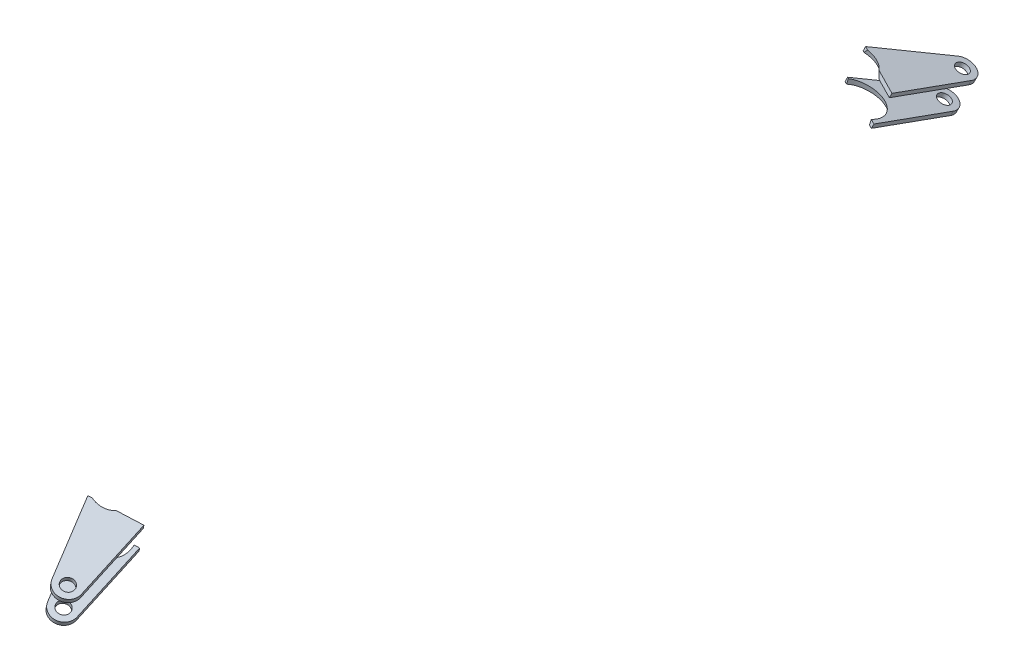
ISO-10303-21;
HEADER;
FILE_DESCRIPTION(('STEP AP214'),'2;1');
FILE_NAME('part.step','',(''),(''),'','','');
FILE_SCHEMA(('AUTOMOTIVE_DESIGN { 1 0 10303 214 1 1 1 1 }'));
ENDSEC;
DATA;
#1=APPLICATION_CONTEXT('core data for automotive mechanical design processes');
#2=APPLICATION_PROTOCOL_DEFINITION('international standard','automotive_design',2000,#1);
#3=PRODUCT_CONTEXT('',#1,'mechanical');
#4=PRODUCT('Part','Part','',(#3));
#5=PRODUCT_RELATED_PRODUCT_CATEGORY('part','',(#4));
#6=PRODUCT_DEFINITION_FORMATION('','',#4);
#7=PRODUCT_DEFINITION_CONTEXT('part definition',#1,'design');
#8=PRODUCT_DEFINITION('design','',#6,#7);
#9=PRODUCT_DEFINITION_SHAPE('','',#8);
#10=(LENGTH_UNIT() NAMED_UNIT(*) SI_UNIT(.MILLI.,.METRE.));
#11=(NAMED_UNIT(*) PLANE_ANGLE_UNIT() SI_UNIT($,.RADIAN.));
#12=(NAMED_UNIT(*) SI_UNIT($,.STERADIAN.) SOLID_ANGLE_UNIT());
#13=UNCERTAINTY_MEASURE_WITH_UNIT(LENGTH_MEASURE(1.E-05),#10,'distance_accuracy_value','');
#14=(GEOMETRIC_REPRESENTATION_CONTEXT(3) GLOBAL_UNCERTAINTY_ASSIGNED_CONTEXT((#13)) GLOBAL_UNIT_ASSIGNED_CONTEXT((#10,
#11,#12)) REPRESENTATION_CONTEXT('',''));
#15=CARTESIAN_POINT('',(0.,0.,0.));
#16=DIRECTION('',(0.,0.,1.));
#17=DIRECTION('',(1.,0.,0.));
#18=AXIS2_PLACEMENT_3D('',#15,#16,#17);
#19=CARTESIAN_POINT('',(65.509107510844,142.808017049709,61.5963410270793));
#20=DIRECTION('',(0.238532030320798,-0.311910311438893,0.919681699355343));
#21=DIRECTION('',(0.,0.947017715663108,0.321181329189959));
#22=AXIS2_PLACEMENT_3D('',#19,#20,#21);
#23=PLANE('',#22);
#24=CARTESIAN_POINT('',(-451.22587702484,300.360441759017,249.052578308913));
#25=DIRECTION('',(-0.238532030320798,0.311910311438893,-0.919681699355343));
#26=DIRECTION('',(-0.0564909458741268,-0.949870645928136,-0.307497201675579));
#27=AXIS2_PLACEMENT_3D('',#24,#25,#26);
#28=ELLIPSE('',#27,27.2986113026391,12.7);
#29=CARTESIAN_POINT('',(-439.445683527146,295.601499883743,244.383227469353));
#30=VERTEX_POINT('',#29);
#31=CARTESIAN_POINT('',(-439.077746763346,298.540869585477,245.284686111386));
#32=VERTEX_POINT('',#31);
#33=EDGE_CURVE('E62',#30,#32,#28,.F.);
#34=ORIENTED_EDGE('',*,*,#33,.T.);
#35=DIRECTION('',(-0.904396460600313,0.273659914769476,0.327379432924534));
#36=VECTOR('',#35,1.);
#37=CARTESIAN_POINT('',(66.5704866198724,145.537559113499,62.2467828068874));
#38=LINE('',#37,#36);
#39=CARTESIAN_POINT('',(-436.327090954802,297.708552933522,244.28898546681));
#40=VERTEX_POINT('',#39);
#41=EDGE_CURVE('E54',#40,#32,#38,.T.);
#42=ORIENTED_EDGE('',*,*,#41,.F.);
#43=DIRECTION('',(0.353793036342809,0.909847354596614,0.216813926602697));
#44=VECTOR('',#43,1.);
#45=CARTESIAN_POINT('',(-437.38847006383,294.979010869732,243.638543687002));
#46=LINE('',#45,#44);
#47=CARTESIAN_POINT('',(-437.38847006383,294.979010869732,243.638543687002));
#48=VERTEX_POINT('',#47);
#49=EDGE_CURVE('E160',#48,#40,#46,.T.);
#50=ORIENTED_EDGE('',*,*,#49,.F.);
#51=DIRECTION('',(-0.904396460600313,0.273659914769476,0.327379432924534));
#52=VECTOR('',#51,1.);
#53=CARTESIAN_POINT('',(65.509107510844,142.808017049709,61.5963410270793));
#54=LINE('',#53,#52);
#55=EDGE_CURVE('E122',#48,#30,#54,.T.);
#56=ORIENTED_EDGE('',*,*,#55,.T.);
#57=EDGE_LOOP('',(#34,#42,#50,#56));
#58=FACE_BOUND('',#57,.T.);
#59=ADVANCED_FACE('F50',(#58),#23,.F.);
#60=CARTESIAN_POINT('',(-440.64941340119,280.785016101808,308.523986498986));
#61=DIRECTION('',(0.856095376886292,-0.221635104127078,-0.466881769072747));
#62=DIRECTION('',(0.47878941810841,0.,0.877929776865673));
#63=AXIS2_PLACEMENT_3D('',#60,#61,#62);
#64=PLANE('',#63);
#65=DIRECTION('',(0.376737565301436,-0.350792918902482,0.857329070391657));
#66=VECTOR('',#65,1.);
#67=CARTESIAN_POINT('',(-439.588034292162,283.514558165598,309.174428278794));
#68=LINE('',#67,#66);
#69=CARTESIAN_POINT('',(-463.740195596516,306.003441521254,254.212163014794));
#70=VERTEX_POINT('',#69);
#71=CARTESIAN_POINT('',(-445.032900342176,288.584454641648,296.783728813158));
#72=VERTEX_POINT('',#71);
#73=EDGE_CURVE('E138',#70,#72,#68,.T.);
#74=ORIENTED_EDGE('',*,*,#73,.F.);
#75=DIRECTION('',(0.353793036342809,0.909847354596614,0.216813926602697));
#76=VECTOR('',#75,1.);
#77=CARTESIAN_POINT('',(-464.801574705544,303.273899457464,253.561721234986));
#78=LINE('',#77,#76);
#79=CARTESIAN_POINT('',(-464.801574705544,303.273899457464,253.561721234986));
#80=VERTEX_POINT('',#79);
#81=EDGE_CURVE('E116',#80,#70,#78,.T.);
#82=ORIENTED_EDGE('',*,*,#81,.F.);
#83=DIRECTION('',(0.376737565301436,-0.350792918902482,0.857329070391657));
#84=VECTOR('',#83,1.);
#85=CARTESIAN_POINT('',(-440.64941340119,280.785016101808,308.523986498986));
#86=LINE('',#85,#84);
#87=CARTESIAN_POINT('',(-446.094279451204,285.854912577858,296.13328703335));
#88=VERTEX_POINT('',#87);
#89=EDGE_CURVE('E128',#80,#88,#86,.T.);
#90=ORIENTED_EDGE('',*,*,#89,.T.);
#91=DIRECTION('',(0.353793036342809,0.909847354596614,0.216813926602697));
#92=VECTOR('',#91,1.);
#93=CARTESIAN_POINT('',(-446.094279451204,285.854912577858,296.13328703335));
#94=LINE('',#93,#92);
#95=EDGE_CURVE('E151',#88,#72,#94,.T.);
#96=ORIENTED_EDGE('',*,*,#95,.T.);
#97=EDGE_LOOP('',(#74,#82,#90,#96));
#98=FACE_BOUND('',#97,.T.);
#99=ADVANCED_FACE('F166',(#98),#64,.F.);
#100=CARTESIAN_POINT('',(-439.245516436114,284.081831744841,292.398232880768));
#101=DIRECTION('',(0.353793036342809,0.909847354596614,0.216813926602697));
#102=DIRECTION('',(-0.932017297863073,0.362413791796086,0.));
#103=AXIS2_PLACEMENT_3D('',#100,#101,#102);
#104=CYLINDRICAL_SURFACE('',#103,7.99999999999998);
#105=CARTESIAN_POINT('',(-438.184137327086,286.811373808631,293.048674660576));
#106=DIRECTION('',(0.35379303634281,0.909847354596614,0.216813926602697));
#107=DIRECTION('',(0.932017297863072,-0.362413791796086,0.));
#108=AXIS2_PLACEMENT_3D('',#105,#106,#107);
#109=CIRCLE('',#108,7.99999999999998);
#110=CARTESIAN_POINT('',(-430.756237334963,284.302047261385,291.458208695423));
#111=VERTEX_POINT('',#110);
#112=EDGE_CURVE('E163',#72,#111,#109,.T.);
#113=ORIENTED_EDGE('',*,*,#112,.F.);
#114=ORIENTED_EDGE('',*,*,#95,.F.);
#115=CARTESIAN_POINT('',(-439.245516436114,284.081831744841,292.398232880768));
#116=DIRECTION('',(0.35379303634281,0.909847354596614,0.216813926602697));
#117=DIRECTION('',(0.932017297863072,-0.362413791796086,0.));
#118=AXIS2_PLACEMENT_3D('',#115,#116,#117);
#119=CIRCLE('',#118,7.99999999999998);
#120=CARTESIAN_POINT('',(-431.817616443992,281.572505197595,290.807766915615));
#121=VERTEX_POINT('',#120);
#122=EDGE_CURVE('E129',#88,#121,#119,.T.);
#123=ORIENTED_EDGE('',*,*,#122,.T.);
#124=DIRECTION('',(0.353793036342809,0.909847354596614,0.216813926602697));
#125=VECTOR('',#124,1.);
#126=CARTESIAN_POINT('',(-431.817616443992,281.572505197595,290.807766915615));
#127=LINE('',#126,#125);
#128=EDGE_CURVE('E119',#121,#111,#127,.T.);
#129=ORIENTED_EDGE('',*,*,#128,.T.);
#130=EDGE_LOOP('',(#113,#114,#123,#129));
#131=FACE_BOUND('',#130,.T.);
#132=ADVANCED_FACE('F147',(#131),#104,.T.);
#133=CARTESIAN_POINT('',(-449.055234692874,323.055596048309,144.854360382786));
#134=DIRECTION('',(-0.928487499015328,0.313665818405775,0.198808245644131));
#135=DIRECTION('',(-0.320054618058769,-0.947399093022183,0.));
#136=AXIS2_PLACEMENT_3D('',#133,#134,#135);
#137=PLANE('',#136);
#138=DIRECTION('',(-0.112878038641702,0.271645993339455,-0.955754677045853));
#139=VECTOR('',#138,1.);
#140=CARTESIAN_POINT('',(-447.993855583846,325.785138112098,145.504802162594));
#141=LINE('',#140,#139);
#142=EDGE_CURVE('E155',#111,#40,#141,.T.);
#143=ORIENTED_EDGE('',*,*,#142,.F.);
#144=ORIENTED_EDGE('',*,*,#128,.F.);
#145=DIRECTION('',(-0.112878038641702,0.271645993339455,-0.955754677045853));
#146=VECTOR('',#145,1.);
#147=CARTESIAN_POINT('',(-449.055234692874,323.055596048309,144.854360382786));
#148=LINE('',#147,#146);
#149=EDGE_CURVE('E140',#121,#48,#148,.T.);
#150=ORIENTED_EDGE('',*,*,#149,.T.);
#151=ORIENTED_EDGE('',*,*,#49,.T.);
#152=EDGE_LOOP('',(#143,#144,#150,#151));
#153=FACE_BOUND('',#152,.T.);
#154=ADVANCED_FACE('F154',(#153),#137,.F.);
#155=CARTESIAN_POINT('',(-462.905614847322,305.750907033734,253.910055936423));
#156=VERTEX_POINT('',#155);
#157=CARTESIAN_POINT('',(-463.307444461638,302.821792916788,253.020866053354));
#158=VERTEX_POINT('',#157);
#159=EDGE_CURVE('E12',#156,#158,#28,.F.);
#160=ORIENTED_EDGE('',*,*,#159,.T.);
#161=EDGE_CURVE('E121',#158,#80,#54,.T.);
#162=ORIENTED_EDGE('',*,*,#161,.T.);
#163=ORIENTED_EDGE('',*,*,#81,.T.);
#164=EDGE_CURVE('E109',#156,#70,#38,.T.);
#165=ORIENTED_EDGE('',*,*,#164,.F.);
#166=EDGE_LOOP('',(#160,#162,#163,#165));
#167=FACE_BOUND('',#166,.T.);
#168=ADVANCED_FACE('F52',(#167),#23,.F.);
#169=CARTESIAN_POINT('',(-439.245516436114,284.081831744841,292.398232880768));
#170=DIRECTION('',(0.353793036342809,0.909847354596614,0.216813926602697));
#171=DIRECTION('',(-0.932017297863073,0.362413791796086,0.));
#172=AXIS2_PLACEMENT_3D('',#169,#170,#171);
#173=CYLINDRICAL_SURFACE('',#172,4.1);
#174=CARTESIAN_POINT('',(-439.245516436114,284.081831744841,292.398232880768));
#175=DIRECTION('',(0.35379303634281,0.909847354596614,0.216813926602697));
#176=DIRECTION('',(0.932017297863072,-0.362413791796086,0.));
#177=AXIS2_PLACEMENT_3D('',#174,#175,#176);
#178=CIRCLE('',#177,4.1);
#179=CARTESIAN_POINT('',(-435.424245514876,282.595935198477,292.398232880768));
#180=VERTEX_POINT('',#179);
#181=EDGE_CURVE('E118',#180,#180,#178,.T.);
#182=ORIENTED_EDGE('',*,*,#181,.F.);
#183=EDGE_LOOP('',(#182));
#184=FACE_BOUND('',#183,.T.);
#185=CARTESIAN_POINT('',(-438.184137327086,286.811373808631,293.048674660576));
#186=DIRECTION('',(0.35379303634281,0.909847354596614,0.216813926602697));
#187=DIRECTION('',(0.932017297863072,-0.362413791796086,0.));
#188=AXIS2_PLACEMENT_3D('',#185,#186,#187);
#189=CIRCLE('',#188,4.1);
#190=CARTESIAN_POINT('',(-434.362866405847,285.325477262267,293.048674660576));
#191=VERTEX_POINT('',#190);
#192=EDGE_CURVE('E142',#191,#191,#189,.T.);
#193=ORIENTED_EDGE('',*,*,#192,.T.);
#194=EDGE_LOOP('',(#193));
#195=FACE_BOUND('',#194,.T.);
#196=ADVANCED_FACE('F177',(#184,#195),#173,.F.);
#197=CARTESIAN_POINT('',(58.8941957018456,151.457837368224,36.0919535223756));
#198=DIRECTION('',(-0.35379303634281,-0.909847354596614,-0.216813926602697));
#199=DIRECTION('',(0.932017297863072,-0.362413791796086,0.));
#200=AXIS2_PLACEMENT_3D('',#197,#198,#199);
#201=PLANE('',#200);
#202=ORIENTED_EDGE('',*,*,#55,.F.);
#203=ORIENTED_EDGE('',*,*,#149,.F.);
#204=ORIENTED_EDGE('',*,*,#122,.F.);
#205=ORIENTED_EDGE('',*,*,#89,.F.);
#206=ORIENTED_EDGE('',*,*,#161,.F.);
#207=CARTESIAN_POINT('',(-451.140805445342,298.984679727286,249.26979301275));
#208=DIRECTION('',(0.35379303634281,0.909847354596614,0.216813926602697));
#209=DIRECTION('',(0.664485143138951,-0.407637223961837,0.626331691828136));
#210=AXIS2_PLACEMENT_3D('',#207,#208,#209);
#211=ELLIPSE('',#210,15.0880933522071,12.7);
#212=EDGE_CURVE('E70',#30,#158,#211,.F.);
#213=ORIENTED_EDGE('',*,*,#212,.F.);
#214=EDGE_LOOP('',(#202,#203,#204,#205,#206,#213));
#215=FACE_BOUND('',#214,.T.);
#216=ORIENTED_EDGE('',*,*,#181,.T.);
#217=EDGE_LOOP('',(#216));
#218=FACE_BOUND('',#217,.T.);
#219=ADVANCED_FACE('F125',(#215,#218),#201,.T.);
#220=CARTESIAN_POINT('',(59.9555748108741,154.187379432014,36.7423953021837));
#221=DIRECTION('',(-0.35379303634281,-0.909847354596614,-0.216813926602697));
#222=DIRECTION('',(0.932017297863072,-0.362413791796086,0.));
#223=AXIS2_PLACEMENT_3D('',#220,#221,#222);
#224=PLANE('',#223);
#225=CARTESIAN_POINT('',(-451.358094444602,302.498637700767,248.714985333152));
#226=DIRECTION('',(0.35379303634281,0.909847354596614,0.216813926602697));
#227=DIRECTION('',(0.664485143138951,-0.407637223961837,0.626331691828136));
#228=AXIS2_PLACEMENT_3D('',#225,#226,#227);
#229=ELLIPSE('',#228,15.0880933522071,12.7);
#230=EDGE_CURVE('E60',#32,#156,#229,.F.);
#231=ORIENTED_EDGE('',*,*,#230,.T.);
#232=ORIENTED_EDGE('',*,*,#164,.T.);
#233=ORIENTED_EDGE('',*,*,#73,.T.);
#234=ORIENTED_EDGE('',*,*,#112,.T.);
#235=ORIENTED_EDGE('',*,*,#142,.T.);
#236=ORIENTED_EDGE('',*,*,#41,.T.);
#237=EDGE_LOOP('',(#231,#232,#233,#234,#235,#236));
#238=FACE_BOUND('',#237,.T.);
#239=ORIENTED_EDGE('',*,*,#192,.F.);
#240=EDGE_LOOP('',(#239));
#241=FACE_BOUND('',#240,.T.);
#242=ADVANCED_FACE('F106',(#238,#241),#224,.F.);
#243=CARTESIAN_POINT('',(-454.575221179992,354.525423143221,240.500641187299));
#244=DIRECTION('',(0.0609657391469297,-0.985926788350095,0.155664853656615));
#245=DIRECTION('',(0.,0.155954951815569,0.987764168718528));
#246=AXIS2_PLACEMENT_3D('',#243,#244,#245);
#247=CYLINDRICAL_SURFACE('',#246,12.7);
#248=ORIENTED_EDGE('',*,*,#33,.F.);
#249=ORIENTED_EDGE('',*,*,#212,.T.);
#250=ORIENTED_EDGE('',*,*,#159,.F.);
#251=ORIENTED_EDGE('',*,*,#230,.F.);
#252=EDGE_LOOP('',(#248,#249,#250,#251));
#253=FACE_BOUND('',#252,.T.);
#254=ADVANCED_FACE('F120',(#253),#247,.F.);
#255=CLOSED_SHELL('',(#59,#99,#132,#154,#168,#196,#219,#242,#254));
#256=MANIFOLD_SOLID_BREP('B2',#255);
#257=CARTESIAN_POINT('',(74.0001403830716,164.644353560028,66.7998752655442));
#258=DIRECTION('',(0.238532030320798,-0.311910311438893,0.919681699355343));
#259=DIRECTION('',(-0.658959447664686,-0.747624203922958,-0.0826468150748394));
#260=AXIS2_PLACEMENT_3D('',#257,#258,#259);
#261=PLANE('',#260);
#262=CARTESIAN_POINT('',(-451.22587702484,300.360441759017,249.052578308913));
#263=DIRECTION('',(-0.238532030320798,0.311910311438893,-0.919681699355343));
#264=DIRECTION('',(-0.0564909458741268,-0.949870645928136,-0.30749720167558));
#265=AXIS2_PLACEMENT_3D('',#262,#263,#264);
#266=ELLIPSE('',#265,27.2986113026391,12.7);
#267=CARTESIAN_POINT('',(-440.853096983068,317.382288720289,252.135220168057));
#268=VERTEX_POINT('',#267);
#269=CARTESIAN_POINT('',(-442.396616524072,320.900043004722,253.728600448871));
#270=VERTEX_POINT('',#269);
#271=EDGE_CURVE('E48',#268,#270,#266,.F.);
#272=ORIENTED_EDGE('',*,*,#271,.T.);
#273=DIRECTION('',(-0.904396460600313,0.273659914769475,0.327379432924534));
#274=VECTOR('',#273,1.);
#275=CARTESIAN_POINT('',(74.0001403830716,164.644353560028,66.7998752655442));
#276=LINE('',#275,#274);
#277=CARTESIAN_POINT('',(-428.897437191603,316.815347380051,248.842077925466));
#278=VERTEX_POINT('',#277);
#279=EDGE_CURVE('E333',#278,#270,#276,.T.);
#280=ORIENTED_EDGE('',*,*,#279,.F.);
#281=DIRECTION('',(-0.353793036342809,-0.909847354596614,-0.216813926602697));
#282=VECTOR('',#281,1.);
#283=CARTESIAN_POINT('',(-428.897437191603,316.815347380051,248.842077925466));
#284=LINE('',#283,#282);
#285=CARTESIAN_POINT('',(-429.958816300631,314.085805316261,248.191636145658));
#286=VERTEX_POINT('',#285);
#287=EDGE_CURVE('E327',#278,#286,#284,.T.);
#288=ORIENTED_EDGE('',*,*,#287,.T.);
#289=DIRECTION('',(-0.904396460600313,0.273659914769475,0.327379432924534));
#290=VECTOR('',#289,1.);
#291=CARTESIAN_POINT('',(72.9387612740432,161.914811496238,66.1494334857361));
#292=LINE('',#291,#290);
#293=EDGE_CURVE('E265',#286,#268,#292,.T.);
#294=ORIENTED_EDGE('',*,*,#293,.T.);
#295=EDGE_LOOP('',(#272,#280,#288,#294));
#296=FACE_BOUND('',#295,.T.);
#297=ADVANCED_FACE('F261',(#296),#261,.F.);
#298=CARTESIAN_POINT('',(-432.158380528963,302.621352612126,313.727520737451));
#299=DIRECTION('',(0.856095376886292,-0.221635104127078,-0.466881769072747));
#300=DIRECTION('',(0.224242571165703,-0.654616545610361,0.72193659520082));
#301=AXIS2_PLACEMENT_3D('',#298,#299,#300);
#302=PLANE('',#301);
#303=DIRECTION('',(0.376737565301436,-0.350792918902481,0.857329070391657));
#304=VECTOR('',#303,1.);
#305=CARTESIAN_POINT('',(-433.219759637991,299.891810548337,313.077078957643));
#306=LINE('',#305,#304);
#307=CARTESIAN_POINT('',(-457.371920942345,322.380693903993,258.114813693642));
#308=VERTEX_POINT('',#307);
#309=CARTESIAN_POINT('',(-438.664625688005,304.961707024387,300.686379492006));
#310=VERTEX_POINT('',#309);
#311=EDGE_CURVE('E359',#308,#310,#306,.T.);
#312=ORIENTED_EDGE('',*,*,#311,.T.);
#313=DIRECTION('',(-0.353793036342809,-0.909847354596614,-0.216813926602697));
#314=VECTOR('',#313,1.);
#315=CARTESIAN_POINT('',(-437.603246578977,307.691249088177,301.336821271814));
#316=LINE('',#315,#314);
#317=CARTESIAN_POINT('',(-437.603246578977,307.691249088177,301.336821271814));
#318=VERTEX_POINT('',#317);
#319=EDGE_CURVE('E341',#318,#310,#316,.T.);
#320=ORIENTED_EDGE('',*,*,#319,.F.);
#321=DIRECTION('',(0.376737565301436,-0.350792918902481,0.857329070391657));
#322=VECTOR('',#321,1.);
#323=CARTESIAN_POINT('',(-432.158380528963,302.621352612126,313.727520737451));
#324=LINE('',#323,#322);
#325=CARTESIAN_POINT('',(-456.310541833317,325.110235967783,258.765255473451));
#326=VERTEX_POINT('',#325);
#327=EDGE_CURVE('E338',#326,#318,#324,.T.);
#328=ORIENTED_EDGE('',*,*,#327,.F.);
#329=DIRECTION('',(-0.353793036342809,-0.909847354596614,-0.216813926602697));
#330=VECTOR('',#329,1.);
#331=CARTESIAN_POINT('',(-456.310541833317,325.110235967783,258.765255473451));
#332=LINE('',#331,#330);
#333=EDGE_CURVE('E343',#326,#308,#332,.T.);
#334=ORIENTED_EDGE('',*,*,#333,.T.);
#335=EDGE_LOOP('',(#312,#320,#328,#334));
#336=FACE_BOUND('',#335,.T.);
#337=ADVANCED_FACE('F369',(#336),#302,.F.);
#338=CARTESIAN_POINT('',(-430.754483563887,305.91816825516,297.601767119232));
#339=DIRECTION('',(-0.353793036342809,-0.909847354596614,-0.216813926602697));
#340=DIRECTION('',(-0.932017297863073,0.362413791796086,0.));
#341=AXIS2_PLACEMENT_3D('',#338,#339,#340);
#342=CYLINDRICAL_SURFACE('',#341,7.99999999999998);
#343=CARTESIAN_POINT('',(-431.815862672915,303.18862619137,296.951325339424));
#344=DIRECTION('',(0.353793036342808,0.909847354596614,0.216813926602696));
#345=DIRECTION('',(0.932017297863073,-0.362413791796086,0.));
#346=AXIS2_PLACEMENT_3D('',#343,#344,#345);
#347=CIRCLE('',#346,7.99999999999998);
#348=CARTESIAN_POINT('',(-424.387962680793,300.679299644124,295.360859374271));
#349=VERTEX_POINT('',#348);
#350=EDGE_CURVE('E356',#310,#349,#347,.T.);
#351=ORIENTED_EDGE('',*,*,#350,.T.);
#352=DIRECTION('',(-0.353793036342809,-0.909847354596614,-0.216813926602697));
#353=VECTOR('',#352,1.);
#354=CARTESIAN_POINT('',(-423.326583571764,303.408841707914,296.011301154079));
#355=LINE('',#354,#353);
#356=CARTESIAN_POINT('',(-423.326583571764,303.408841707914,296.011301154079));
#357=VERTEX_POINT('',#356);
#358=EDGE_CURVE('E348',#357,#349,#355,.T.);
#359=ORIENTED_EDGE('',*,*,#358,.F.);
#360=CARTESIAN_POINT('',(-430.754483563887,305.91816825516,297.601767119232));
#361=DIRECTION('',(0.353793036342808,0.909847354596614,0.216813926602696));
#362=DIRECTION('',(0.932017297863073,-0.362413791796086,0.));
#363=AXIS2_PLACEMENT_3D('',#360,#361,#362);
#364=CIRCLE('',#363,7.99999999999998);
#365=EDGE_CURVE('E364',#318,#357,#364,.T.);
#366=ORIENTED_EDGE('',*,*,#365,.F.);
#367=ORIENTED_EDGE('',*,*,#319,.T.);
#368=EDGE_LOOP('',(#351,#359,#366,#367));
#369=FACE_BOUND('',#368,.T.);
#370=ADVANCED_FACE('F374',(#369),#342,.T.);
#371=CARTESIAN_POINT('',(-440.564201820647,344.891932558627,150.057894621251));
#372=DIRECTION('',(-0.928487499015328,0.313665818405775,0.198808245644131));
#373=DIRECTION('',(0.369998641846834,0.827206590419058,0.422883272072537));
#374=AXIS2_PLACEMENT_3D('',#371,#372,#373);
#375=PLANE('',#374);
#376=DIRECTION('',(-0.112878038641702,0.271645993339455,-0.955754677045853));
#377=VECTOR('',#376,1.);
#378=CARTESIAN_POINT('',(-441.625580929675,342.162390494837,149.407452841443));
#379=LINE('',#378,#377);
#380=EDGE_CURVE('E328',#349,#286,#379,.T.);
#381=ORIENTED_EDGE('',*,*,#380,.T.);
#382=ORIENTED_EDGE('',*,*,#287,.F.);
#383=DIRECTION('',(-0.112878038641702,0.271645993339455,-0.955754677045853));
#384=VECTOR('',#383,1.);
#385=CARTESIAN_POINT('',(-440.564201820647,344.891932558627,150.057894621251));
#386=LINE('',#385,#384);
#387=EDGE_CURVE('E337',#357,#278,#386,.T.);
#388=ORIENTED_EDGE('',*,*,#387,.F.);
#389=ORIENTED_EDGE('',*,*,#358,.T.);
#390=EDGE_LOOP('',(#381,#382,#388,#389));
#391=FACE_BOUND('',#390,.T.);
#392=ADVANCED_FACE('F376',(#391),#375,.F.);
#393=CARTESIAN_POINT('',(-454.198380439784,324.471120345249,258.000681274652));
#394=VERTEX_POINT('',#393);
#395=CARTESIAN_POINT('',(-456.511666358904,322.120390811002,257.803413030364));
#396=VERTEX_POINT('',#395);
#397=EDGE_CURVE('E273',#394,#396,#266,.F.);
#398=ORIENTED_EDGE('',*,*,#397,.T.);
#399=EDGE_CURVE('E321',#396,#308,#292,.T.);
#400=ORIENTED_EDGE('',*,*,#399,.T.);
#401=ORIENTED_EDGE('',*,*,#333,.F.);
#402=EDGE_CURVE('E339',#394,#326,#276,.T.);
#403=ORIENTED_EDGE('',*,*,#402,.F.);
#404=EDGE_LOOP('',(#398,#400,#401,#403));
#405=FACE_BOUND('',#404,.T.);
#406=ADVANCED_FACE('F263',(#405),#261,.F.);
#407=CARTESIAN_POINT('',(-430.754483563887,305.91816825516,297.601767119232));
#408=DIRECTION('',(-0.353793036342809,-0.909847354596614,-0.216813926602697));
#409=DIRECTION('',(-0.932017297863073,0.362413791796086,0.));
#410=AXIS2_PLACEMENT_3D('',#407,#408,#409);
#411=CYLINDRICAL_SURFACE('',#410,4.1);
#412=CARTESIAN_POINT('',(-430.754483563887,305.91816825516,297.601767119232));
#413=DIRECTION('',(0.353793036342808,0.909847354596614,0.216813926602696));
#414=DIRECTION('',(0.932017297863073,-0.362413791796086,0.));
#415=AXIS2_PLACEMENT_3D('',#412,#413,#414);
#416=CIRCLE('',#415,4.1);
#417=CARTESIAN_POINT('',(-426.933212642648,304.432271708796,297.601767119232));
#418=VERTEX_POINT('',#417);
#419=EDGE_CURVE('E330',#418,#418,#416,.T.);
#420=ORIENTED_EDGE('',*,*,#419,.T.);
#421=EDGE_LOOP('',(#420));
#422=FACE_BOUND('',#421,.T.);
#423=CARTESIAN_POINT('',(-431.815862672915,303.18862619137,296.951325339424));
#424=DIRECTION('',(0.353793036342808,0.909847354596614,0.216813926602696));
#425=DIRECTION('',(0.932017297863073,-0.362413791796086,0.));
#426=AXIS2_PLACEMENT_3D('',#423,#424,#425);
#427=CIRCLE('',#426,4.1);
#428=CARTESIAN_POINT('',(-427.994591751677,301.702729645006,296.951325339424));
#429=VERTEX_POINT('',#428);
#430=EDGE_CURVE('E331',#429,#429,#427,.T.);
#431=ORIENTED_EDGE('',*,*,#430,.F.);
#432=EDGE_LOOP('',(#431));
#433=FACE_BOUND('',#432,.T.);
#434=ADVANCED_FACE('F383',(#422,#433),#411,.F.);
#435=CARTESIAN_POINT('',(67.3852285740732,173.294173878543,41.2954877608404));
#436=DIRECTION('',(0.353793036342808,0.909847354596614,0.216813926602696));
#437=DIRECTION('',(0.932017297863073,-0.362413791796086,0.));
#438=AXIS2_PLACEMENT_3D('',#435,#436,#437);
#439=PLANE('',#438);
#440=ORIENTED_EDGE('',*,*,#402,.T.);
#441=ORIENTED_EDGE('',*,*,#327,.T.);
#442=ORIENTED_EDGE('',*,*,#365,.T.);
#443=ORIENTED_EDGE('',*,*,#387,.T.);
#444=ORIENTED_EDGE('',*,*,#279,.T.);
#445=CARTESIAN_POINT('',(-452.879117439424,327.096343515131,244.831331575971));
#446=DIRECTION('',(-0.353793036342808,-0.909847354596614,-0.216813926602696));
#447=DIRECTION('',(0.664485143138951,-0.407637223961835,0.626331691828137));
#448=AXIS2_PLACEMENT_3D('',#445,#446,#447);
#449=ELLIPSE('',#448,15.088093352207,12.7);
#450=EDGE_CURVE('E280',#394,#270,#449,.F.);
#451=ORIENTED_EDGE('',*,*,#450,.F.);
#452=EDGE_LOOP('',(#440,#441,#442,#443,#444,#451));
#453=FACE_BOUND('',#452,.T.);
#454=ORIENTED_EDGE('',*,*,#419,.F.);
#455=EDGE_LOOP('',(#454));
#456=FACE_BOUND('',#455,.T.);
#457=ADVANCED_FACE('F334',(#453,#456),#439,.T.);
#458=CARTESIAN_POINT('',(66.3238494650448,170.564631814754,40.6450459810323));
#459=DIRECTION('',(0.353793036342808,0.909847354596614,0.216813926602696));
#460=DIRECTION('',(0.932017297863073,-0.362413791796086,0.));
#461=AXIS2_PLACEMENT_3D('',#458,#459,#460);
#462=PLANE('',#461);
#463=CARTESIAN_POINT('',(-452.661828440164,323.58238554165,245.386139255568));
#464=DIRECTION('',(-0.353793036342808,-0.909847354596614,-0.216813926602696));
#465=DIRECTION('',(0.664485143138951,-0.407637223961835,0.626331691828137));
#466=AXIS2_PLACEMENT_3D('',#463,#464,#465);
#467=ELLIPSE('',#466,15.088093352207,12.7);
#468=EDGE_CURVE('E271',#396,#268,#467,.F.);
#469=ORIENTED_EDGE('',*,*,#468,.T.);
#470=ORIENTED_EDGE('',*,*,#293,.F.);
#471=ORIENTED_EDGE('',*,*,#380,.F.);
#472=ORIENTED_EDGE('',*,*,#350,.F.);
#473=ORIENTED_EDGE('',*,*,#311,.F.);
#474=ORIENTED_EDGE('',*,*,#399,.F.);
#475=EDGE_LOOP('',(#469,#470,#471,#472,#473,#474));
#476=FACE_BOUND('',#475,.T.);
#477=ORIENTED_EDGE('',*,*,#430,.T.);
#478=EDGE_LOOP('',(#477));
#479=FACE_BOUND('',#478,.T.);
#480=ADVANCED_FACE('F317',(#476,#479),#462,.F.);
#481=CARTESIAN_POINT('',(-454.575221179992,354.525423143221,240.500641187299));
#482=DIRECTION('',(0.0609657391469297,-0.985926788350095,0.155664853656615));
#483=DIRECTION('',(0.,0.155954951815569,0.987764168718528));
#484=AXIS2_PLACEMENT_3D('',#481,#482,#483);
#485=CYLINDRICAL_SURFACE('',#484,12.7);
#486=ORIENTED_EDGE('',*,*,#397,.F.);
#487=ORIENTED_EDGE('',*,*,#450,.T.);
#488=ORIENTED_EDGE('',*,*,#271,.F.);
#489=ORIENTED_EDGE('',*,*,#468,.F.);
#490=EDGE_LOOP('',(#486,#487,#488,#489));
#491=FACE_BOUND('',#490,.T.);
#492=ADVANCED_FACE('F329',(#491),#485,.F.);
#493=CLOSED_SHELL('',(#297,#337,#370,#392,#406,#434,#457,#480,#492));
#494=MANIFOLD_SOLID_BREP('B6',#493);
#495=CARTESIAN_POINT('',(65.509107510844,142.808017049709,-61.5963410270793));
#496=DIRECTION('',(0.238532030320798,-0.311910311438893,-0.919681699355343));
#497=DIRECTION('',(0.,0.947017715663108,-0.321181329189959));
#498=AXIS2_PLACEMENT_3D('',#495,#496,#497);
#499=PLANE('',#498);
#500=CARTESIAN_POINT('',(-451.22587702484,300.360441759017,-249.052578308913));
#501=DIRECTION('',(0.238532030320798,-0.311910311438893,-0.919681699355343));
#502=DIRECTION('',(-0.0564909458741268,-0.949870645928136,0.307497201675579));
#503=AXIS2_PLACEMENT_3D('',#500,#501,#502);
#504=ELLIPSE('',#503,27.2986113026391,12.7);
#505=CARTESIAN_POINT('',(-439.445683527146,295.601499883743,-244.383227469353));
#506=VERTEX_POINT('',#505);
#507=CARTESIAN_POINT('',(-439.077746763346,298.540869585477,-245.284686111386));
#508=VERTEX_POINT('',#507);
#509=EDGE_CURVE('E483',#506,#508,#504,.F.);
#510=ORIENTED_EDGE('',*,*,#509,.F.);
#511=DIRECTION('',(-0.904396460600313,0.273659914769476,-0.327379432924534));
#512=VECTOR('',#511,1.);
#513=CARTESIAN_POINT('',(65.509107510844,142.808017049709,-61.5963410270793));
#514=LINE('',#513,#512);
#515=CARTESIAN_POINT('',(-437.38847006383,294.979010869732,-243.638543687002));
#516=VERTEX_POINT('',#515);
#517=EDGE_CURVE('E541',#516,#506,#514,.T.);
#518=ORIENTED_EDGE('',*,*,#517,.F.);
#519=DIRECTION('',(0.353793036342809,0.909847354596614,-0.216813926602697));
#520=VECTOR('',#519,1.);
#521=CARTESIAN_POINT('',(-437.38847006383,294.979010869732,-243.638543687002));
#522=LINE('',#521,#520);
#523=CARTESIAN_POINT('',(-436.327090954802,297.708552933522,-244.28898546681));
#524=VERTEX_POINT('',#523);
#525=EDGE_CURVE('E546',#516,#524,#522,.T.);
#526=ORIENTED_EDGE('',*,*,#525,.T.);
#527=DIRECTION('',(-0.904396460600313,0.273659914769476,-0.327379432924534));
#528=VECTOR('',#527,1.);
#529=CARTESIAN_POINT('',(66.5704866198724,145.537559113499,-62.2467828068874));
#530=LINE('',#529,#528);
#531=EDGE_CURVE('E475',#524,#508,#530,.T.);
#532=ORIENTED_EDGE('',*,*,#531,.T.);
#533=EDGE_LOOP('',(#510,#518,#526,#532));
#534=FACE_BOUND('',#533,.T.);
#535=ADVANCED_FACE('F471',(#534),#499,.F.);
#536=CARTESIAN_POINT('',(-440.64941340119,280.785016101808,-308.523986498986));
#537=DIRECTION('',(0.856095376886292,-0.221635104127078,0.466881769072747));
#538=DIRECTION('',(0.47878941810841,0.,-0.877929776865673));
#539=AXIS2_PLACEMENT_3D('',#536,#537,#538);
#540=PLANE('',#539);
#541=DIRECTION('',(0.376737565301436,-0.350792918902482,-0.857329070391657));
#542=VECTOR('',#541,1.);
#543=CARTESIAN_POINT('',(-439.588034292162,283.514558165598,-309.174428278794));
#544=LINE('',#543,#542);
#545=CARTESIAN_POINT('',(-463.740195596516,306.003441521254,-254.212163014794));
#546=VERTEX_POINT('',#545);
#547=CARTESIAN_POINT('',(-445.032900342176,288.584454641648,-296.783728813158));
#548=VERTEX_POINT('',#547);
#549=EDGE_CURVE('E537',#546,#548,#544,.T.);
#550=ORIENTED_EDGE('',*,*,#549,.T.);
#551=DIRECTION('',(0.353793036342809,0.909847354596614,-0.216813926602697));
#552=VECTOR('',#551,1.);
#553=CARTESIAN_POINT('',(-446.094279451204,285.854912577858,-296.13328703335));
#554=LINE('',#553,#552);
#555=CARTESIAN_POINT('',(-446.094279451204,285.854912577858,-296.13328703335));
#556=VERTEX_POINT('',#555);
#557=EDGE_CURVE('E563',#556,#548,#554,.T.);
#558=ORIENTED_EDGE('',*,*,#557,.F.);
#559=DIRECTION('',(0.376737565301436,-0.350792918902482,-0.857329070391657));
#560=VECTOR('',#559,1.);
#561=CARTESIAN_POINT('',(-440.64941340119,280.785016101808,-308.523986498986));
#562=LINE('',#561,#560);
#563=CARTESIAN_POINT('',(-464.801574705544,303.273899457464,-253.561721234986));
#564=VERTEX_POINT('',#563);
#565=EDGE_CURVE('E568',#564,#556,#562,.T.);
#566=ORIENTED_EDGE('',*,*,#565,.F.);
#567=DIRECTION('',(0.353793036342809,0.909847354596614,-0.216813926602697));
#568=VECTOR('',#567,1.);
#569=CARTESIAN_POINT('',(-464.801574705544,303.273899457464,-253.561721234986));
#570=LINE('',#569,#568);
#571=EDGE_CURVE('E549',#564,#546,#570,.T.);
#572=ORIENTED_EDGE('',*,*,#571,.T.);
#573=EDGE_LOOP('',(#550,#558,#566,#572));
#574=FACE_BOUND('',#573,.T.);
#575=ADVANCED_FACE('F578',(#574),#540,.F.);
#576=CARTESIAN_POINT('',(-439.245516436114,284.081831744841,-292.398232880768));
#577=DIRECTION('',(0.353793036342809,0.909847354596614,-0.216813926602697));
#578=DIRECTION('',(-0.932017297863073,0.362413791796086,0.));
#579=AXIS2_PLACEMENT_3D('',#576,#577,#578);
#580=CYLINDRICAL_SURFACE('',#579,7.99999999999998);
#581=CARTESIAN_POINT('',(-438.184137327086,286.811373808631,-293.048674660576));
#582=DIRECTION('',(-0.35379303634281,-0.909847354596614,0.216813926602697));
#583=DIRECTION('',(0.932017297863072,-0.362413791796086,0.));
#584=AXIS2_PLACEMENT_3D('',#581,#582,#583);
#585=CIRCLE('',#584,7.99999999999998);
#586=CARTESIAN_POINT('',(-430.756237334963,284.302047261385,-291.458208695423));
#587=VERTEX_POINT('',#586);
#588=EDGE_CURVE('E557',#548,#587,#585,.T.);
#589=ORIENTED_EDGE('',*,*,#588,.T.);
#590=DIRECTION('',(0.353793036342809,0.909847354596614,-0.216813926602697));
#591=VECTOR('',#590,1.);
#592=CARTESIAN_POINT('',(-431.817616443992,281.572505197595,-290.807766915615));
#593=LINE('',#592,#591);
#594=CARTESIAN_POINT('',(-431.817616443992,281.572505197595,-290.807766915615));
#595=VERTEX_POINT('',#594);
#596=EDGE_CURVE('E539',#595,#587,#593,.T.);
#597=ORIENTED_EDGE('',*,*,#596,.F.);
#598=CARTESIAN_POINT('',(-439.245516436114,284.081831744841,-292.398232880768));
#599=DIRECTION('',(-0.35379303634281,-0.909847354596614,0.216813926602697));
#600=DIRECTION('',(0.932017297863072,-0.362413791796086,0.));
#601=AXIS2_PLACEMENT_3D('',#598,#599,#600);
#602=CIRCLE('',#601,7.99999999999998);
#603=EDGE_CURVE('E566',#556,#595,#602,.T.);
#604=ORIENTED_EDGE('',*,*,#603,.F.);
#605=ORIENTED_EDGE('',*,*,#557,.T.);
#606=EDGE_LOOP('',(#589,#597,#604,#605));
#607=FACE_BOUND('',#606,.T.);
#608=ADVANCED_FACE('F581',(#607),#580,.T.);
#609=CARTESIAN_POINT('',(-449.055234692874,323.055596048309,-144.854360382786));
#610=DIRECTION('',(-0.928487499015328,0.313665818405775,-0.198808245644131));
#611=DIRECTION('',(-0.320054618058769,-0.947399093022183,0.));
#612=AXIS2_PLACEMENT_3D('',#609,#610,#611);
#613=PLANE('',#612);
#614=DIRECTION('',(-0.112878038641702,0.271645993339455,0.955754677045853));
#615=VECTOR('',#614,1.);
#616=CARTESIAN_POINT('',(-447.993855583846,325.785138112098,-145.504802162594));
#617=LINE('',#616,#615);
#618=EDGE_CURVE('E544',#587,#524,#617,.T.);
#619=ORIENTED_EDGE('',*,*,#618,.T.);
#620=ORIENTED_EDGE('',*,*,#525,.F.);
#621=DIRECTION('',(-0.112878038641702,0.271645993339455,0.955754677045853));
#622=VECTOR('',#621,1.);
#623=CARTESIAN_POINT('',(-449.055234692874,323.055596048309,-144.854360382786));
#624=LINE('',#623,#622);
#625=EDGE_CURVE('E561',#595,#516,#624,.T.);
#626=ORIENTED_EDGE('',*,*,#625,.F.);
#627=ORIENTED_EDGE('',*,*,#596,.T.);
#628=EDGE_LOOP('',(#619,#620,#626,#627));
#629=FACE_BOUND('',#628,.T.);
#630=ADVANCED_FACE('F585',(#629),#613,.F.);
#631=CARTESIAN_POINT('',(-462.905614847322,305.750907033734,-253.910055936423));
#632=VERTEX_POINT('',#631);
#633=CARTESIAN_POINT('',(-463.307444461638,302.821792916788,-253.020866053354));
#634=VERTEX_POINT('',#633);
#635=EDGE_CURVE('E259',#632,#634,#504,.F.);
#636=ORIENTED_EDGE('',*,*,#635,.F.);
#637=EDGE_CURVE('E530',#632,#546,#530,.T.);
#638=ORIENTED_EDGE('',*,*,#637,.T.);
#639=ORIENTED_EDGE('',*,*,#571,.F.);
#640=EDGE_CURVE('E532',#634,#564,#514,.T.);
#641=ORIENTED_EDGE('',*,*,#640,.F.);
#642=EDGE_LOOP('',(#636,#638,#639,#641));
#643=FACE_BOUND('',#642,.T.);
#644=ADVANCED_FACE('F473',(#643),#499,.F.);
#645=CARTESIAN_POINT('',(-439.245516436114,284.081831744841,-292.398232880768));
#646=DIRECTION('',(0.353793036342809,0.909847354596614,-0.216813926602697));
#647=DIRECTION('',(-0.932017297863073,0.362413791796086,0.));
#648=AXIS2_PLACEMENT_3D('',#645,#646,#647);
#649=CYLINDRICAL_SURFACE('',#648,4.1);
#650=CARTESIAN_POINT('',(-439.245516436114,284.081831744841,-292.398232880768));
#651=DIRECTION('',(-0.35379303634281,-0.909847354596614,0.216813926602697));
#652=DIRECTION('',(0.932017297863072,-0.362413791796086,0.));
#653=AXIS2_PLACEMENT_3D('',#650,#651,#652);
#654=CIRCLE('',#653,4.1);
#655=CARTESIAN_POINT('',(-435.424245514876,282.595935198477,-292.398232880768));
#656=VERTEX_POINT('',#655);
#657=EDGE_CURVE('E538',#656,#656,#654,.T.);
#658=ORIENTED_EDGE('',*,*,#657,.T.);
#659=EDGE_LOOP('',(#658));
#660=FACE_BOUND('',#659,.T.);
#661=CARTESIAN_POINT('',(-438.184137327086,286.811373808631,-293.048674660576));
#662=DIRECTION('',(-0.35379303634281,-0.909847354596614,0.216813926602697));
#663=DIRECTION('',(0.932017297863072,-0.362413791796086,0.));
#664=AXIS2_PLACEMENT_3D('',#661,#662,#663);
#665=CIRCLE('',#664,4.1);
#666=CARTESIAN_POINT('',(-434.362866405847,285.325477262267,-293.048674660576));
#667=VERTEX_POINT('',#666);
#668=EDGE_CURVE('E558',#667,#667,#665,.T.);
#669=ORIENTED_EDGE('',*,*,#668,.F.);
#670=EDGE_LOOP('',(#669));
#671=FACE_BOUND('',#670,.T.);
#672=ADVANCED_FACE('F593',(#660,#671),#649,.F.);
#673=CARTESIAN_POINT('',(58.8941957018456,151.457837368224,-36.0919535223756));
#674=DIRECTION('',(-0.35379303634281,-0.909847354596614,0.216813926602697));
#675=DIRECTION('',(0.932017297863072,-0.362413791796086,0.));
#676=AXIS2_PLACEMENT_3D('',#673,#674,#675);
#677=PLANE('',#676);
#678=ORIENTED_EDGE('',*,*,#517,.T.);
#679=CARTESIAN_POINT('',(-451.140805445342,298.984679727286,-249.26979301275));
#680=DIRECTION('',(-0.35379303634281,-0.909847354596614,0.216813926602697));
#681=DIRECTION('',(0.664485143138951,-0.407637223961837,-0.626331691828136));
#682=AXIS2_PLACEMENT_3D('',#679,#680,#681);
#683=ELLIPSE('',#682,15.0880933522071,12.7);
#684=EDGE_CURVE('E490',#506,#634,#683,.F.);
#685=ORIENTED_EDGE('',*,*,#684,.T.);
#686=ORIENTED_EDGE('',*,*,#640,.T.);
#687=ORIENTED_EDGE('',*,*,#565,.T.);
#688=ORIENTED_EDGE('',*,*,#603,.T.);
#689=ORIENTED_EDGE('',*,*,#625,.T.);
#690=EDGE_LOOP('',(#678,#685,#686,#687,#688,#689));
#691=FACE_BOUND('',#690,.T.);
#692=ORIENTED_EDGE('',*,*,#657,.F.);
#693=EDGE_LOOP('',(#692));
#694=FACE_BOUND('',#693,.T.);
#695=ADVANCED_FACE('F573',(#691,#694),#677,.T.);
#696=CARTESIAN_POINT('',(59.9555748108741,154.187379432014,-36.7423953021837));
#697=DIRECTION('',(-0.35379303634281,-0.909847354596614,0.216813926602697));
#698=DIRECTION('',(0.932017297863072,-0.362413791796086,0.));
#699=AXIS2_PLACEMENT_3D('',#696,#697,#698);
#700=PLANE('',#699);
#701=CARTESIAN_POINT('',(-451.358094444602,302.498637700767,-248.714985333152));
#702=DIRECTION('',(-0.35379303634281,-0.909847354596614,0.216813926602697));
#703=DIRECTION('',(0.664485143138951,-0.407637223961837,-0.626331691828136));
#704=AXIS2_PLACEMENT_3D('',#701,#702,#703);
#705=ELLIPSE('',#704,15.0880933522071,12.7);
#706=EDGE_CURVE('E481',#508,#632,#705,.F.);
#707=ORIENTED_EDGE('',*,*,#706,.F.);
#708=ORIENTED_EDGE('',*,*,#531,.F.);
#709=ORIENTED_EDGE('',*,*,#618,.F.);
#710=ORIENTED_EDGE('',*,*,#588,.F.);
#711=ORIENTED_EDGE('',*,*,#549,.F.);
#712=ORIENTED_EDGE('',*,*,#637,.F.);
#713=EDGE_LOOP('',(#707,#708,#709,#710,#711,#712));
#714=FACE_BOUND('',#713,.T.);
#715=ORIENTED_EDGE('',*,*,#668,.T.);
#716=EDGE_LOOP('',(#715));
#717=FACE_BOUND('',#716,.T.);
#718=ADVANCED_FACE('F534',(#714,#717),#700,.F.);
#719=CARTESIAN_POINT('',(-454.575221179992,354.525423143221,-240.500641187299));
#720=DIRECTION('',(0.0609657391469297,-0.985926788350095,-0.155664853656615));
#721=DIRECTION('',(0.,0.155954951815569,-0.987764168718528));
#722=AXIS2_PLACEMENT_3D('',#719,#720,#721);
#723=CYLINDRICAL_SURFACE('',#722,12.7);
#724=ORIENTED_EDGE('',*,*,#509,.T.);
#725=ORIENTED_EDGE('',*,*,#706,.T.);
#726=ORIENTED_EDGE('',*,*,#635,.T.);
#727=ORIENTED_EDGE('',*,*,#684,.F.);
#728=EDGE_LOOP('',(#724,#725,#726,#727));
#729=FACE_BOUND('',#728,.T.);
#730=ADVANCED_FACE('F521',(#729),#723,.F.);
#731=CLOSED_SHELL('',(#535,#575,#608,#630,#644,#672,#695,#718,#730));
#732=MANIFOLD_SOLID_BREP('B42',#731);
#733=CARTESIAN_POINT('',(74.0001403830716,164.644353560028,-66.7998752655442));
#734=DIRECTION('',(0.238532030320798,-0.311910311438893,-0.919681699355343));
#735=DIRECTION('',(-0.658959447664686,-0.747624203922958,0.0826468150748394));
#736=AXIS2_PLACEMENT_3D('',#733,#734,#735);
#737=PLANE('',#736);
#738=CARTESIAN_POINT('',(-451.22587702484,300.360441759017,-249.052578308913));
#739=DIRECTION('',(0.238532030320798,-0.311910311438893,-0.919681699355343));
#740=DIRECTION('',(-0.0564909458741268,-0.949870645928136,0.30749720167558));
#741=AXIS2_PLACEMENT_3D('',#738,#739,#740);
#742=ELLIPSE('',#741,27.2986113026391,12.7);
#743=CARTESIAN_POINT('',(-440.853096983068,317.382288720289,-252.135220168057));
#744=VERTEX_POINT('',#743);
#745=CARTESIAN_POINT('',(-442.396616524072,320.900043004722,-253.728600448871));
#746=VERTEX_POINT('',#745);
#747=EDGE_CURVE('E469',#744,#746,#742,.F.);
#748=ORIENTED_EDGE('',*,*,#747,.F.);
#749=DIRECTION('',(-0.904396460600313,0.273659914769475,-0.327379432924534));
#750=VECTOR('',#749,1.);
#751=CARTESIAN_POINT('',(72.9387612740432,161.914811496238,-66.1494334857361));
#752=LINE('',#751,#750);
#753=CARTESIAN_POINT('',(-429.958816300631,314.085805316261,-248.191636145658));
#754=VERTEX_POINT('',#753);
#755=EDGE_CURVE('E676',#754,#744,#752,.T.);
#756=ORIENTED_EDGE('',*,*,#755,.F.);
#757=DIRECTION('',(-0.353793036342809,-0.909847354596614,0.216813926602697));
#758=VECTOR('',#757,1.);
#759=CARTESIAN_POINT('',(-428.897437191603,316.815347380051,-248.842077925466));
#760=LINE('',#759,#758);
#761=CARTESIAN_POINT('',(-428.897437191603,316.815347380051,-248.842077925466));
#762=VERTEX_POINT('',#761);
#763=EDGE_CURVE('E756',#762,#754,#760,.T.);
#764=ORIENTED_EDGE('',*,*,#763,.F.);
#765=DIRECTION('',(-0.904396460600313,0.273659914769475,-0.327379432924534));
#766=VECTOR('',#765,1.);
#767=CARTESIAN_POINT('',(74.0001403830716,164.644353560028,-66.7998752655442));
#768=LINE('',#767,#766);
#769=EDGE_CURVE('E731',#762,#746,#768,.T.);
#770=ORIENTED_EDGE('',*,*,#769,.T.);
#771=EDGE_LOOP('',(#748,#756,#764,#770));
#772=FACE_BOUND('',#771,.T.);
#773=ADVANCED_FACE('F672',(#772),#737,.F.);
#774=CARTESIAN_POINT('',(-432.158380528963,302.621352612126,-313.727520737451));
#775=DIRECTION('',(0.856095376886292,-0.221635104127078,0.466881769072747));
#776=DIRECTION('',(0.224242571165703,-0.654616545610361,-0.72193659520082));
#777=AXIS2_PLACEMENT_3D('',#774,#775,#776);
#778=PLANE('',#777);
#779=DIRECTION('',(0.376737565301436,-0.350792918902481,-0.857329070391657));
#780=VECTOR('',#779,1.);
#781=CARTESIAN_POINT('',(-433.219759637991,299.891810548337,-313.077078957643));
#782=LINE('',#781,#780);
#783=CARTESIAN_POINT('',(-457.371920942345,322.380693903993,-258.114813693642));
#784=VERTEX_POINT('',#783);
#785=CARTESIAN_POINT('',(-438.664625688005,304.961707024387,-300.686379492006));
#786=VERTEX_POINT('',#785);
#787=EDGE_CURVE('E740',#784,#786,#782,.T.);
#788=ORIENTED_EDGE('',*,*,#787,.F.);
#789=DIRECTION('',(-0.353793036342809,-0.909847354596614,0.216813926602697));
#790=VECTOR('',#789,1.);
#791=CARTESIAN_POINT('',(-456.310541833317,325.110235967783,-258.765255473451));
#792=LINE('',#791,#790);
#793=CARTESIAN_POINT('',(-456.310541833317,325.110235967783,-258.765255473451));
#794=VERTEX_POINT('',#793);
#795=EDGE_CURVE('E765',#794,#784,#792,.T.);
#796=ORIENTED_EDGE('',*,*,#795,.F.);
#797=DIRECTION('',(0.376737565301436,-0.350792918902481,-0.857329070391657));
#798=VECTOR('',#797,1.);
#799=CARTESIAN_POINT('',(-432.158380528963,302.621352612126,-313.727520737451));
#800=LINE('',#799,#798);
#801=CARTESIAN_POINT('',(-437.603246578977,307.691249088177,-301.336821271814));
#802=VERTEX_POINT('',#801);
#803=EDGE_CURVE('E762',#794,#802,#800,.T.);
#804=ORIENTED_EDGE('',*,*,#803,.T.);
#805=DIRECTION('',(-0.353793036342809,-0.909847354596614,0.216813926602697));
#806=VECTOR('',#805,1.);
#807=CARTESIAN_POINT('',(-437.603246578977,307.691249088177,-301.336821271814));
#808=LINE('',#807,#806);
#809=EDGE_CURVE('E761',#802,#786,#808,.T.);
#810=ORIENTED_EDGE('',*,*,#809,.T.);
#811=EDGE_LOOP('',(#788,#796,#804,#810));
#812=FACE_BOUND('',#811,.T.);
#813=ADVANCED_FACE('F784',(#812),#778,.F.);
#814=CARTESIAN_POINT('',(-430.754483563887,305.91816825516,-297.601767119232));
#815=DIRECTION('',(-0.353793036342809,-0.909847354596614,0.216813926602697));
#816=DIRECTION('',(-0.932017297863073,0.362413791796086,0.));
#817=AXIS2_PLACEMENT_3D('',#814,#815,#816);
#818=CYLINDRICAL_SURFACE('',#817,7.99999999999998);
#819=CARTESIAN_POINT('',(-431.815862672915,303.18862619137,-296.951325339424));
#820=DIRECTION('',(-0.353793036342808,-0.909847354596614,0.216813926602696));
#821=DIRECTION('',(0.932017297863073,-0.362413791796086,0.));
#822=AXIS2_PLACEMENT_3D('',#819,#820,#821);
#823=CIRCLE('',#822,7.99999999999998);
#824=CARTESIAN_POINT('',(-424.387962680793,300.679299644124,-295.360859374271));
#825=VERTEX_POINT('',#824);
#826=EDGE_CURVE('E738',#786,#825,#823,.T.);
#827=ORIENTED_EDGE('',*,*,#826,.F.);
#828=ORIENTED_EDGE('',*,*,#809,.F.);
#829=CARTESIAN_POINT('',(-430.754483563887,305.91816825516,-297.601767119232));
#830=DIRECTION('',(-0.353793036342808,-0.909847354596614,0.216813926602696));
#831=DIRECTION('',(0.932017297863073,-0.362413791796086,0.));
#832=AXIS2_PLACEMENT_3D('',#829,#830,#831);
#833=CIRCLE('',#832,7.99999999999998);
#834=CARTESIAN_POINT('',(-423.326583571764,303.408841707914,-296.011301154079));
#835=VERTEX_POINT('',#834);
#836=EDGE_CURVE('E758',#802,#835,#833,.T.);
#837=ORIENTED_EDGE('',*,*,#836,.T.);
#838=DIRECTION('',(-0.353793036342809,-0.909847354596614,0.216813926602697));
#839=VECTOR('',#838,1.);
#840=CARTESIAN_POINT('',(-423.326583571764,303.408841707914,-296.011301154079));
#841=LINE('',#840,#839);
#842=EDGE_CURVE('E757',#835,#825,#841,.T.);
#843=ORIENTED_EDGE('',*,*,#842,.T.);
#844=EDGE_LOOP('',(#827,#828,#837,#843));
#845=FACE_BOUND('',#844,.T.);
#846=ADVANCED_FACE('F781',(#845),#818,.T.);
#847=CARTESIAN_POINT('',(-440.564201820647,344.891932558627,-150.057894621251));
#848=DIRECTION('',(-0.928487499015328,0.313665818405775,-0.198808245644131));
#849=DIRECTION('',(0.369998641846834,0.827206590419058,-0.422883272072537));
#850=AXIS2_PLACEMENT_3D('',#847,#848,#849);
#851=PLANE('',#850);
#852=DIRECTION('',(-0.112878038641702,0.271645993339455,0.955754677045853));
#853=VECTOR('',#852,1.);
#854=CARTESIAN_POINT('',(-441.625580929675,342.162390494837,-149.407452841443));
#855=LINE('',#854,#853);
#856=EDGE_CURVE('E736',#825,#754,#855,.T.);
#857=ORIENTED_EDGE('',*,*,#856,.F.);
#858=ORIENTED_EDGE('',*,*,#842,.F.);
#859=DIRECTION('',(-0.112878038641702,0.271645993339455,0.955754677045853));
#860=VECTOR('',#859,1.);
#861=CARTESIAN_POINT('',(-440.564201820647,344.891932558627,-150.057894621251));
#862=LINE('',#861,#860);
#863=EDGE_CURVE('E753',#835,#762,#862,.T.);
#864=ORIENTED_EDGE('',*,*,#863,.T.);
#865=ORIENTED_EDGE('',*,*,#763,.T.);
#866=EDGE_LOOP('',(#857,#858,#864,#865));
#867=FACE_BOUND('',#866,.T.);
#868=ADVANCED_FACE('F788',(#867),#851,.F.);
#869=CARTESIAN_POINT('',(-454.198380439784,324.471120345249,-258.000681274652));
#870=VERTEX_POINT('',#869);
#871=CARTESIAN_POINT('',(-456.511666358904,322.120390811002,-257.803413030364));
#872=VERTEX_POINT('',#871);
#873=EDGE_CURVE('E684',#870,#872,#742,.F.);
#874=ORIENTED_EDGE('',*,*,#873,.F.);
#875=EDGE_CURVE('E764',#870,#794,#768,.T.);
#876=ORIENTED_EDGE('',*,*,#875,.T.);
#877=ORIENTED_EDGE('',*,*,#795,.T.);
#878=EDGE_CURVE('E737',#872,#784,#752,.T.);
#879=ORIENTED_EDGE('',*,*,#878,.F.);
#880=EDGE_LOOP('',(#874,#876,#877,#879));
#881=FACE_BOUND('',#880,.T.);
#882=ADVANCED_FACE('F674',(#881),#737,.F.);
#883=CARTESIAN_POINT('',(-430.754483563887,305.91816825516,-297.601767119232));
#884=DIRECTION('',(-0.353793036342809,-0.909847354596614,0.216813926602697));
#885=DIRECTION('',(-0.932017297863073,0.362413791796086,0.));
#886=AXIS2_PLACEMENT_3D('',#883,#884,#885);
#887=CYLINDRICAL_SURFACE('',#886,4.1);
#888=CARTESIAN_POINT('',(-430.754483563887,305.91816825516,-297.601767119232));
#889=DIRECTION('',(-0.353793036342808,-0.909847354596614,0.216813926602696));
#890=DIRECTION('',(0.932017297863073,-0.362413791796086,0.));
#891=AXIS2_PLACEMENT_3D('',#888,#889,#890);
#892=CIRCLE('',#891,4.1);
#893=CARTESIAN_POINT('',(-426.933212642648,304.432271708796,-297.601767119232));
#894=VERTEX_POINT('',#893);
#895=EDGE_CURVE('E741',#894,#894,#892,.T.);
#896=ORIENTED_EDGE('',*,*,#895,.F.);
#897=EDGE_LOOP('',(#896));
#898=FACE_BOUND('',#897,.T.);
#899=CARTESIAN_POINT('',(-431.815862672915,303.18862619137,-296.951325339424));
#900=DIRECTION('',(-0.353793036342808,-0.909847354596614,0.216813926602696));
#901=DIRECTION('',(0.932017297863073,-0.362413791796086,0.));
#902=AXIS2_PLACEMENT_3D('',#899,#900,#901);
#903=CIRCLE('',#902,4.1);
#904=CARTESIAN_POINT('',(-427.994591751677,301.702729645006,-296.951325339424));
#905=VERTEX_POINT('',#904);
#906=EDGE_CURVE('E749',#905,#905,#903,.T.);
#907=ORIENTED_EDGE('',*,*,#906,.T.);
#908=EDGE_LOOP('',(#907));
#909=FACE_BOUND('',#908,.T.);
#910=ADVANCED_FACE('F795',(#898,#909),#887,.F.);
#911=CARTESIAN_POINT('',(67.3852285740732,173.294173878543,-41.2954877608404));
#912=DIRECTION('',(0.353793036342808,0.909847354596614,-0.216813926602696));
#913=DIRECTION('',(0.932017297863073,-0.362413791796086,0.));
#914=AXIS2_PLACEMENT_3D('',#911,#912,#913);
#915=PLANE('',#914);
#916=ORIENTED_EDGE('',*,*,#875,.F.);
#917=CARTESIAN_POINT('',(-452.879117439424,327.096343515131,-244.831331575971));
#918=DIRECTION('',(0.353793036342808,0.909847354596614,-0.216813926602696));
#919=DIRECTION('',(0.664485143138951,-0.407637223961835,-0.626331691828137));
#920=AXIS2_PLACEMENT_3D('',#917,#918,#919);
#921=ELLIPSE('',#920,15.088093352207,12.7);
#922=EDGE_CURVE('E690',#870,#746,#921,.F.);
#923=ORIENTED_EDGE('',*,*,#922,.T.);
#924=ORIENTED_EDGE('',*,*,#769,.F.);
#925=ORIENTED_EDGE('',*,*,#863,.F.);
#926=ORIENTED_EDGE('',*,*,#836,.F.);
#927=ORIENTED_EDGE('',*,*,#803,.F.);
#928=EDGE_LOOP('',(#916,#923,#924,#925,#926,#927));
#929=FACE_BOUND('',#928,.T.);
#930=ORIENTED_EDGE('',*,*,#895,.T.);
#931=EDGE_LOOP('',(#930));
#932=FACE_BOUND('',#931,.T.);
#933=ADVANCED_FACE('F787',(#929,#932),#915,.T.);
#934=CARTESIAN_POINT('',(66.3238494650448,170.564631814754,-40.6450459810323));
#935=DIRECTION('',(0.353793036342808,0.909847354596614,-0.216813926602696));
#936=DIRECTION('',(0.932017297863073,-0.362413791796086,0.));
#937=AXIS2_PLACEMENT_3D('',#934,#935,#936);
#938=PLANE('',#937);
#939=CARTESIAN_POINT('',(-452.661828440164,323.58238554165,-245.386139255568));
#940=DIRECTION('',(0.353793036342808,0.909847354596614,-0.216813926602696));
#941=DIRECTION('',(0.664485143138951,-0.407637223961835,-0.626331691828137));
#942=AXIS2_PLACEMENT_3D('',#939,#940,#941);
#943=ELLIPSE('',#942,15.088093352207,12.7);
#944=EDGE_CURVE('E682',#872,#744,#943,.F.);
#945=ORIENTED_EDGE('',*,*,#944,.F.);
#946=ORIENTED_EDGE('',*,*,#878,.T.);
#947=ORIENTED_EDGE('',*,*,#787,.T.);
#948=ORIENTED_EDGE('',*,*,#826,.T.);
#949=ORIENTED_EDGE('',*,*,#856,.T.);
#950=ORIENTED_EDGE('',*,*,#755,.T.);
#951=EDGE_LOOP('',(#945,#946,#947,#948,#949,#950));
#952=FACE_BOUND('',#951,.T.);
#953=ORIENTED_EDGE('',*,*,#906,.F.);
#954=EDGE_LOOP('',(#953));
#955=FACE_BOUND('',#954,.T.);
#956=ADVANCED_FACE('F733',(#952,#955),#938,.F.);
#957=CARTESIAN_POINT('',(-454.575221179992,354.525423143221,-240.500641187299));
#958=DIRECTION('',(0.0609657391469297,-0.985926788350095,-0.155664853656615));
#959=DIRECTION('',(0.,0.155954951815569,-0.987764168718528));
#960=AXIS2_PLACEMENT_3D('',#957,#958,#959);
#961=CYLINDRICAL_SURFACE('',#960,12.7);
#962=ORIENTED_EDGE('',*,*,#873,.T.);
#963=ORIENTED_EDGE('',*,*,#944,.T.);
#964=ORIENTED_EDGE('',*,*,#747,.T.);
#965=ORIENTED_EDGE('',*,*,#922,.F.);
#966=EDGE_LOOP('',(#962,#963,#964,#965));
#967=FACE_BOUND('',#966,.T.);
#968=ADVANCED_FACE('F722',(#967),#961,.F.);
#969=CLOSED_SHELL('',(#773,#813,#846,#868,#882,#910,#933,#956,#968));
#970=MANIFOLD_SOLID_BREP('B253',#969);
#971=ADVANCED_BREP_SHAPE_REPRESENTATION('',(#18,#256,#494,#732,#970),#14);
#972=SHAPE_DEFINITION_REPRESENTATION(#9,#971);
ENDSEC;
END-ISO-10303-21;
